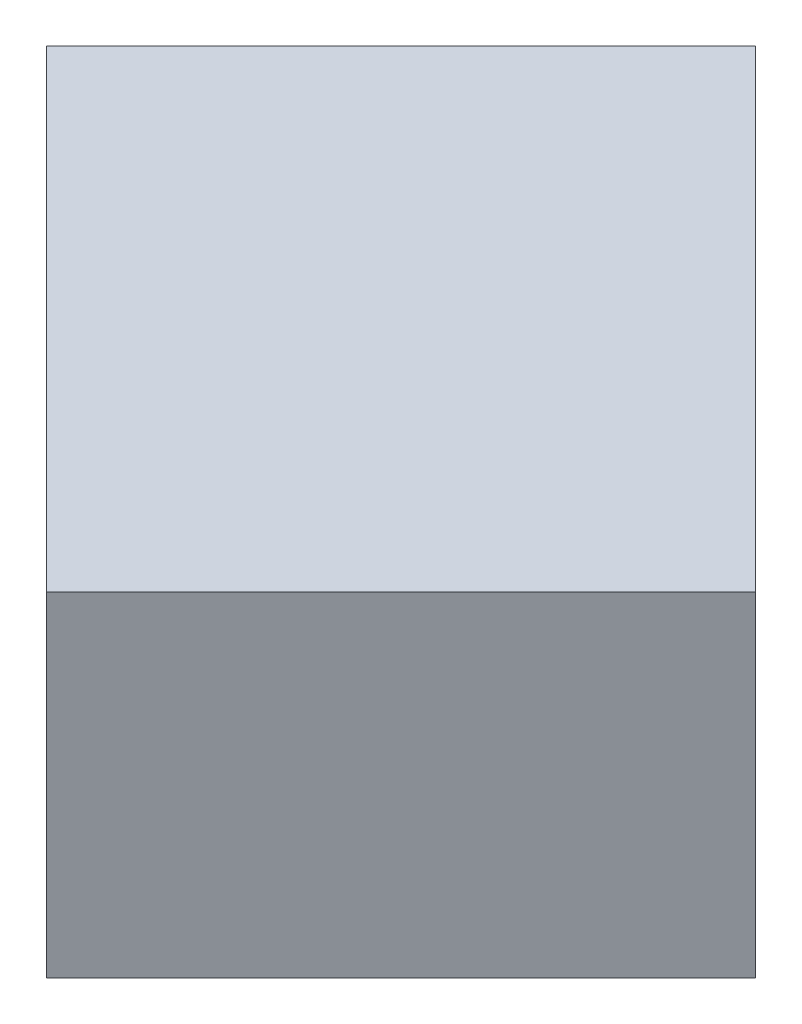
ISO-10303-21;
HEADER;
FILE_DESCRIPTION(('STEP AP214'),'2;1');
FILE_NAME('part.step','',(''),(''),'','','');
FILE_SCHEMA(('AUTOMOTIVE_DESIGN { 1 0 10303 214 1 1 1 1 }'));
ENDSEC;
DATA;
#1=APPLICATION_CONTEXT('core data for automotive mechanical design processes');
#2=APPLICATION_PROTOCOL_DEFINITION('international standard','automotive_design',2000,#1);
#3=PRODUCT_CONTEXT('',#1,'mechanical');
#4=PRODUCT('Part','Part','',(#3));
#5=PRODUCT_RELATED_PRODUCT_CATEGORY('part','',(#4));
#6=PRODUCT_DEFINITION_FORMATION('','',#4);
#7=PRODUCT_DEFINITION_CONTEXT('part definition',#1,'design');
#8=PRODUCT_DEFINITION('design','',#6,#7);
#9=PRODUCT_DEFINITION_SHAPE('','',#8);
#10=(LENGTH_UNIT() NAMED_UNIT(*) SI_UNIT(.MILLI.,.METRE.));
#11=(NAMED_UNIT(*) PLANE_ANGLE_UNIT() SI_UNIT($,.RADIAN.));
#12=(NAMED_UNIT(*) SI_UNIT($,.STERADIAN.) SOLID_ANGLE_UNIT());
#13=UNCERTAINTY_MEASURE_WITH_UNIT(LENGTH_MEASURE(1.E-05),#10,'distance_accuracy_value','');
#14=(GEOMETRIC_REPRESENTATION_CONTEXT(3) GLOBAL_UNCERTAINTY_ASSIGNED_CONTEXT((#13)) GLOBAL_UNIT_ASSIGNED_CONTEXT((#10,
#11,#12)) REPRESENTATION_CONTEXT('',''));
#15=CARTESIAN_POINT('',(0.,0.,0.));
#16=DIRECTION('',(0.,0.,1.));
#17=DIRECTION('',(1.,0.,0.));
#18=AXIS2_PLACEMENT_3D('',#15,#16,#17);
#19=CARTESIAN_POINT('',(0.,3.505,0.));
#20=DIRECTION('',(0.,1.,0.));
#21=DIRECTION('',(1.,0.,0.));
#22=AXIS2_PLACEMENT_3D('',#19,#20,#21);
#23=PLANE('',#22);
#24=DIRECTION('',(-0.707106781186547,0.,-0.707106781186548));
#25=VECTOR('',#24,1.);
#26=CARTESIAN_POINT('',(17.128198051534,3.505,4.13530483272049));
#27=LINE('',#26,#25);
#28=CARTESIAN_POINT('',(17.128198051534,3.505,4.13530483272049));
#29=VERTEX_POINT('',#28);
#30=CARTESIAN_POINT('',(16.8453553390593,3.505,3.85246212024588));
#31=VERTEX_POINT('',#30);
#32=EDGE_CURVE('E11',#29,#31,#27,.T.);
#33=ORIENTED_EDGE('',*,*,#32,.T.);
#34=DIRECTION('',(-0.707106781186538,0.,0.707106781186557));
#35=VECTOR('',#34,1.);
#36=CARTESIAN_POINT('',(16.8453553390593,3.505,3.85246212024588));
#37=LINE('',#36,#35);
#38=CARTESIAN_POINT('',(16.6332233047033,3.505,4.06459415460184));
#39=VERTEX_POINT('',#38);
#40=EDGE_CURVE('E24',#31,#39,#37,.T.);
#41=ORIENTED_EDGE('',*,*,#40,.T.);
#42=DIRECTION('',(0.707106781186539,0.,0.707106781186556));
#43=VECTOR('',#42,1.);
#44=CARTESIAN_POINT('',(16.6332233047033,3.505,4.06459415460184));
#45=LINE('',#44,#43);
#46=CARTESIAN_POINT('',(16.916066017178,3.505,4.34743686707645));
#47=VERTEX_POINT('',#46);
#48=EDGE_CURVE('E88',#39,#47,#45,.T.);
#49=ORIENTED_EDGE('',*,*,#48,.T.);
#50=DIRECTION('',(0.707106781186551,0.,-0.707106781186545));
#51=VECTOR('',#50,1.);
#52=CARTESIAN_POINT('',(16.916066017178,3.505,4.34743686707645));
#53=LINE('',#52,#51);
#54=EDGE_CURVE('E59',#47,#29,#53,.T.);
#55=ORIENTED_EDGE('',*,*,#54,.T.);
#56=EDGE_LOOP('',(#33,#41,#49,#55));
#57=FACE_BOUND('',#56,.T.);
#58=ADVANCED_FACE('F17',(#57),#23,.T.);
#59=CARTESIAN_POINT('',(16.6332233047034,3.505,4.06459415460184));
#60=DIRECTION('',(0.707106781186552,0.,0.707106781186543));
#61=DIRECTION('',(0.,-1.,0.));
#62=AXIS2_PLACEMENT_3D('',#59,#60,#61);
#63=PLANE('',#62);
#64=DIRECTION('',(0.,-1.,0.));
#65=VECTOR('',#64,1.);
#66=CARTESIAN_POINT('',(16.6332233047033,3.505,4.06459415460184));
#67=LINE('',#66,#65);
#68=CARTESIAN_POINT('',(16.6332233047033,3.305,4.06459415460184));
#69=VERTEX_POINT('',#68);
#70=EDGE_CURVE('E75',#39,#69,#67,.T.);
#71=ORIENTED_EDGE('',*,*,#70,.F.);
#72=ORIENTED_EDGE('',*,*,#40,.F.);
#73=DIRECTION('',(0.,1.,0.));
#74=VECTOR('',#73,1.);
#75=CARTESIAN_POINT('',(16.8453553390593,3.505,3.85246212024588));
#76=LINE('',#75,#74);
#77=CARTESIAN_POINT('',(16.8453553390593,3.305,3.85246212024588));
#78=VERTEX_POINT('',#77);
#79=EDGE_CURVE('E84',#78,#31,#76,.T.);
#80=ORIENTED_EDGE('',*,*,#79,.F.);
#81=DIRECTION('',(0.707106781186543,0.,-0.707106781186552));
#82=VECTOR('',#81,1.);
#83=CARTESIAN_POINT('',(16.6332233047033,3.305,4.06459415460184));
#84=LINE('',#83,#82);
#85=EDGE_CURVE('E82',#69,#78,#84,.T.);
#86=ORIENTED_EDGE('',*,*,#85,.F.);
#87=EDGE_LOOP('',(#71,#72,#80,#86));
#88=FACE_BOUND('',#87,.T.);
#89=ADVANCED_FACE('F90',(#88),#63,.F.);
#90=CARTESIAN_POINT('',(16.8453553390593,3.505,3.85246212024588));
#91=DIRECTION('',(-0.707106781186553,0.,0.707106781186542));
#92=DIRECTION('',(0.,1.,0.));
#93=AXIS2_PLACEMENT_3D('',#90,#91,#92);
#94=PLANE('',#93);
#95=ORIENTED_EDGE('',*,*,#79,.T.);
#96=ORIENTED_EDGE('',*,*,#32,.F.);
#97=DIRECTION('',(0.,1.,0.));
#98=VECTOR('',#97,1.);
#99=CARTESIAN_POINT('',(17.128198051534,3.505,4.13530483272049));
#100=LINE('',#99,#98);
#101=CARTESIAN_POINT('',(17.128198051534,3.305,4.13530483272049));
#102=VERTEX_POINT('',#101);
#103=EDGE_CURVE('E80',#102,#29,#100,.T.);
#104=ORIENTED_EDGE('',*,*,#103,.F.);
#105=DIRECTION('',(0.707106781186542,0.,0.707106781186553));
#106=VECTOR('',#105,1.);
#107=CARTESIAN_POINT('',(16.8453553390593,3.305,3.85246212024588));
#108=LINE('',#107,#106);
#109=EDGE_CURVE('E63',#78,#102,#108,.T.);
#110=ORIENTED_EDGE('',*,*,#109,.F.);
#111=EDGE_LOOP('',(#95,#96,#104,#110));
#112=FACE_BOUND('',#111,.T.);
#113=ADVANCED_FACE('F91',(#112),#94,.F.);
#114=CARTESIAN_POINT('',(16.916066017178,3.505,4.34743686707645));
#115=DIRECTION('',(-0.707106781186551,0.,-0.707106781186545));
#116=DIRECTION('',(-0.707106781186545,0.,0.707106781186551));
#117=AXIS2_PLACEMENT_3D('',#114,#115,#116);
#118=PLANE('',#117);
#119=ORIENTED_EDGE('',*,*,#103,.T.);
#120=ORIENTED_EDGE('',*,*,#54,.F.);
#121=DIRECTION('',(0.,1.,0.));
#122=VECTOR('',#121,1.);
#123=CARTESIAN_POINT('',(16.916066017178,3.505,4.34743686707645));
#124=LINE('',#123,#122);
#125=CARTESIAN_POINT('',(16.916066017178,3.305,4.34743686707645));
#126=VERTEX_POINT('',#125);
#127=EDGE_CURVE('E54',#126,#47,#124,.T.);
#128=ORIENTED_EDGE('',*,*,#127,.F.);
#129=DIRECTION('',(-0.707106781186545,0.,0.707106781186551));
#130=VECTOR('',#129,1.);
#131=CARTESIAN_POINT('',(16.916066017178,3.305,4.34743686707645));
#132=LINE('',#131,#130);
#133=EDGE_CURVE('E58',#102,#126,#132,.T.);
#134=ORIENTED_EDGE('',*,*,#133,.F.);
#135=EDGE_LOOP('',(#119,#120,#128,#134));
#136=FACE_BOUND('',#135,.T.);
#137=ADVANCED_FACE('F57',(#136),#118,.F.);
#138=CARTESIAN_POINT('',(16.6332233047034,3.505,4.06459415460184));
#139=DIRECTION('',(0.707106781186552,0.,-0.707106781186543));
#140=DIRECTION('',(0.,-1.,0.));
#141=AXIS2_PLACEMENT_3D('',#138,#139,#140);
#142=PLANE('',#141);
#143=ORIENTED_EDGE('',*,*,#127,.T.);
#144=ORIENTED_EDGE('',*,*,#48,.F.);
#145=ORIENTED_EDGE('',*,*,#70,.T.);
#146=DIRECTION('',(-0.707106781186543,0.,-0.707106781186552));
#147=VECTOR('',#146,1.);
#148=CARTESIAN_POINT('',(16.6332233047033,3.305,4.06459415460184));
#149=LINE('',#148,#147);
#150=EDGE_CURVE('E70',#126,#69,#149,.T.);
#151=ORIENTED_EDGE('',*,*,#150,.F.);
#152=EDGE_LOOP('',(#143,#144,#145,#151));
#153=FACE_BOUND('',#152,.T.);
#154=ADVANCED_FACE('F73',(#153),#142,.F.);
#155=CARTESIAN_POINT('',(0.,3.305,0.));
#156=DIRECTION('',(0.,1.,0.));
#157=DIRECTION('',(1.,0.,0.));
#158=AXIS2_PLACEMENT_3D('',#155,#156,#157);
#159=PLANE('',#158);
#160=ORIENTED_EDGE('',*,*,#85,.T.);
#161=ORIENTED_EDGE('',*,*,#109,.T.);
#162=ORIENTED_EDGE('',*,*,#133,.T.);
#163=ORIENTED_EDGE('',*,*,#150,.T.);
#164=EDGE_LOOP('',(#160,#161,#162,#163));
#165=FACE_BOUND('',#164,.T.);
#166=ADVANCED_FACE('F69',(#165),#159,.F.);
#167=CLOSED_SHELL('',(#58,#89,#113,#137,#154,#166));
#168=MANIFOLD_SOLID_BREP('B1',#167);
#169=ADVANCED_BREP_SHAPE_REPRESENTATION('',(#18,#168),#14);
#170=SHAPE_DEFINITION_REPRESENTATION(#9,#169);
ENDSEC;
END-ISO-10303-21;
